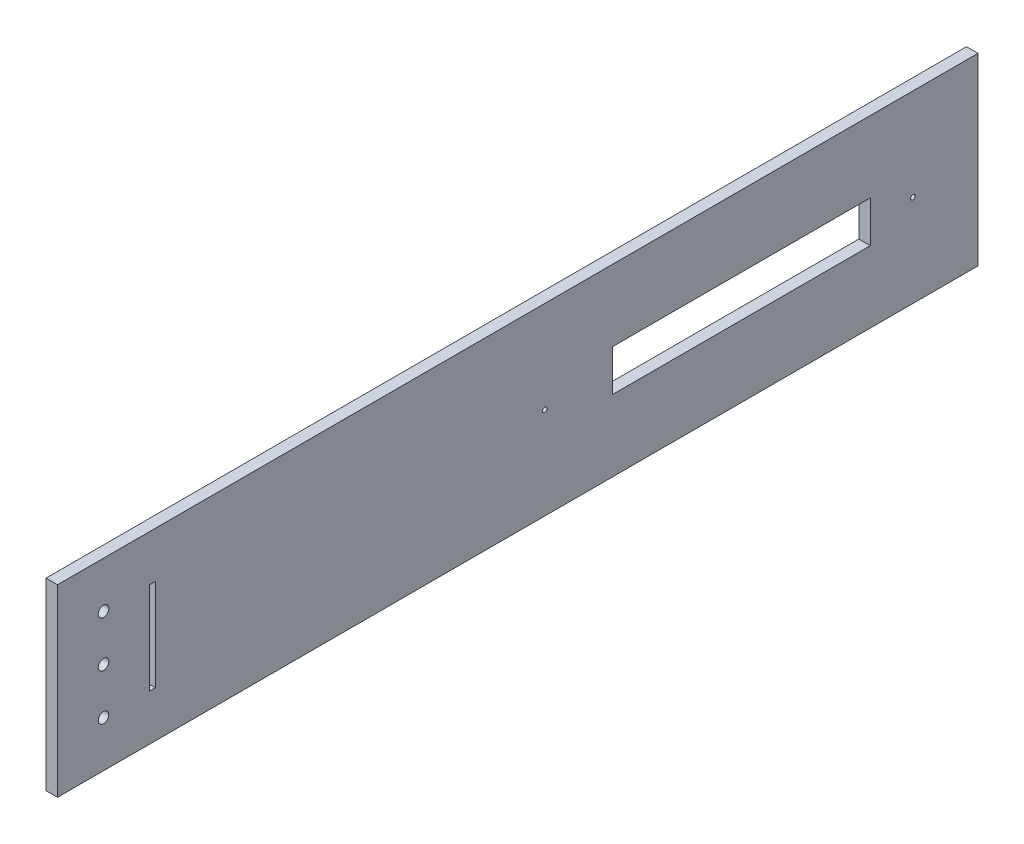
ISO-10303-21;
HEADER;
FILE_DESCRIPTION(('STEP AP214'),'2;1');
FILE_NAME('part.step','',(''),(''),'','','');
FILE_SCHEMA(('AUTOMOTIVE_DESIGN { 1 0 10303 214 1 1 1 1 }'));
ENDSEC;
DATA;
#1=APPLICATION_CONTEXT('core data for automotive mechanical design processes');
#2=APPLICATION_PROTOCOL_DEFINITION('international standard','automotive_design',2000,#1);
#3=PRODUCT_CONTEXT('',#1,'mechanical');
#4=PRODUCT('Part','Part','',(#3));
#5=PRODUCT_RELATED_PRODUCT_CATEGORY('part','',(#4));
#6=PRODUCT_DEFINITION_FORMATION('','',#4);
#7=PRODUCT_DEFINITION_CONTEXT('part definition',#1,'design');
#8=PRODUCT_DEFINITION('design','',#6,#7);
#9=PRODUCT_DEFINITION_SHAPE('','',#8);
#10=(LENGTH_UNIT() NAMED_UNIT(*) SI_UNIT(.MILLI.,.METRE.));
#11=(NAMED_UNIT(*) PLANE_ANGLE_UNIT() SI_UNIT($,.RADIAN.));
#12=(NAMED_UNIT(*) SI_UNIT($,.STERADIAN.) SOLID_ANGLE_UNIT());
#13=UNCERTAINTY_MEASURE_WITH_UNIT(LENGTH_MEASURE(1.E-05),#10,'distance_accuracy_value','');
#14=(GEOMETRIC_REPRESENTATION_CONTEXT(3) GLOBAL_UNCERTAINTY_ASSIGNED_CONTEXT((#13)) GLOBAL_UNIT_ASSIGNED_CONTEXT((#10,
#11,#12)) REPRESENTATION_CONTEXT('',''));
#15=CARTESIAN_POINT('',(0.,0.,0.));
#16=DIRECTION('',(0.,0.,1.));
#17=DIRECTION('',(1.,0.,0.));
#18=AXIS2_PLACEMENT_3D('',#15,#16,#17);
#19=CARTESIAN_POINT('',(-3.175,25.4,0.));
#20=DIRECTION('',(0.,0.,-1.));
#21=DIRECTION('',(0.,1.,0.));
#22=AXIS2_PLACEMENT_3D('',#19,#20,#21);
#23=PLANE('',#22);
#24=DIRECTION('',(0.,1.,0.));
#25=VECTOR('',#24,1.);
#26=CARTESIAN_POINT('',(0.,25.4,0.));
#27=LINE('',#26,#25);
#28=CARTESIAN_POINT('',(0.,-25.4,0.));
#29=VERTEX_POINT('',#28);
#30=CARTESIAN_POINT('',(0.,25.4,0.));
#31=VERTEX_POINT('',#30);
#32=EDGE_CURVE('E211',#29,#31,#27,.T.);
#33=ORIENTED_EDGE('',*,*,#32,.F.);
#34=DIRECTION('',(1.,0.,0.));
#35=VECTOR('',#34,1.);
#36=CARTESIAN_POINT('',(-3.175,-25.4,0.));
#37=LINE('',#36,#35);
#38=CARTESIAN_POINT('',(-3.175,-25.4,0.));
#39=VERTEX_POINT('',#38);
#40=EDGE_CURVE('E11',#39,#29,#37,.T.);
#41=ORIENTED_EDGE('',*,*,#40,.F.);
#42=DIRECTION('',(0.,1.,0.));
#43=VECTOR('',#42,1.);
#44=CARTESIAN_POINT('',(-3.175,25.4,0.));
#45=LINE('',#44,#43);
#46=CARTESIAN_POINT('',(-3.175,25.4,0.));
#47=VERTEX_POINT('',#46);
#48=EDGE_CURVE('E214',#39,#47,#45,.T.);
#49=ORIENTED_EDGE('',*,*,#48,.T.);
#50=DIRECTION('',(1.,0.,0.));
#51=VECTOR('',#50,1.);
#52=CARTESIAN_POINT('',(-3.175,25.4,0.));
#53=LINE('',#52,#51);
#54=EDGE_CURVE('E37',#47,#31,#53,.T.);
#55=ORIENTED_EDGE('',*,*,#54,.T.);
#56=EDGE_LOOP('',(#33,#41,#49,#55));
#57=FACE_BOUND('',#56,.T.);
#58=ADVANCED_FACE('F34',(#57),#23,.T.);
#59=CARTESIAN_POINT('',(-3.175,-25.4,0.));
#60=DIRECTION('',(0.,-1.,0.));
#61=DIRECTION('',(0.,0.,-1.));
#62=AXIS2_PLACEMENT_3D('',#59,#60,#61);
#63=PLANE('',#62);
#64=DIRECTION('',(0.,0.,-1.));
#65=VECTOR('',#64,1.);
#66=CARTESIAN_POINT('',(0.,-25.4,0.));
#67=LINE('',#66,#65);
#68=CARTESIAN_POINT('',(0.,-25.4,254.));
#69=VERTEX_POINT('',#68);
#70=EDGE_CURVE('E218',#69,#29,#67,.T.);
#71=ORIENTED_EDGE('',*,*,#70,.F.);
#72=DIRECTION('',(1.,0.,0.));
#73=VECTOR('',#72,1.);
#74=CARTESIAN_POINT('',(-3.175,-25.4,254.));
#75=LINE('',#74,#73);
#76=CARTESIAN_POINT('',(-3.175,-25.4,254.));
#77=VERTEX_POINT('',#76);
#78=EDGE_CURVE('E42',#77,#69,#75,.T.);
#79=ORIENTED_EDGE('',*,*,#78,.F.);
#80=DIRECTION('',(0.,0.,-1.));
#81=VECTOR('',#80,1.);
#82=CARTESIAN_POINT('',(-3.175,-25.4,0.));
#83=LINE('',#82,#81);
#84=EDGE_CURVE('E224',#77,#39,#83,.T.);
#85=ORIENTED_EDGE('',*,*,#84,.T.);
#86=ORIENTED_EDGE('',*,*,#40,.T.);
#87=EDGE_LOOP('',(#71,#79,#85,#86));
#88=FACE_BOUND('',#87,.T.);
#89=ADVANCED_FACE('F250',(#88),#63,.T.);
#90=CARTESIAN_POINT('',(-3.175,25.4,254.));
#91=DIRECTION('',(0.,0.,1.));
#92=DIRECTION('',(1.,0.,0.));
#93=AXIS2_PLACEMENT_3D('',#90,#91,#92);
#94=PLANE('',#93);
#95=DIRECTION('',(0.,-1.,0.));
#96=VECTOR('',#95,1.);
#97=CARTESIAN_POINT('',(0.,25.4,254.));
#98=LINE('',#97,#96);
#99=CARTESIAN_POINT('',(0.,25.4,254.));
#100=VERTEX_POINT('',#99);
#101=EDGE_CURVE('E232',#100,#69,#98,.T.);
#102=ORIENTED_EDGE('',*,*,#101,.F.);
#103=DIRECTION('',(1.,0.,0.));
#104=VECTOR('',#103,1.);
#105=CARTESIAN_POINT('',(-3.175,25.4,254.));
#106=LINE('',#105,#104);
#107=CARTESIAN_POINT('',(-3.175,25.4,254.));
#108=VERTEX_POINT('',#107);
#109=EDGE_CURVE('E237',#108,#100,#106,.T.);
#110=ORIENTED_EDGE('',*,*,#109,.F.);
#111=DIRECTION('',(0.,-1.,0.));
#112=VECTOR('',#111,1.);
#113=CARTESIAN_POINT('',(-3.175,25.4,254.));
#114=LINE('',#113,#112);
#115=EDGE_CURVE('E221',#108,#77,#114,.T.);
#116=ORIENTED_EDGE('',*,*,#115,.T.);
#117=ORIENTED_EDGE('',*,*,#78,.T.);
#118=EDGE_LOOP('',(#102,#110,#116,#117));
#119=FACE_BOUND('',#118,.T.);
#120=ADVANCED_FACE('F255',(#119),#94,.T.);
#121=CARTESIAN_POINT('',(-3.175,25.4,0.));
#122=DIRECTION('',(0.,1.,0.));
#123=DIRECTION('',(0.,0.,1.));
#124=AXIS2_PLACEMENT_3D('',#121,#122,#123);
#125=PLANE('',#124);
#126=DIRECTION('',(0.,0.,1.));
#127=VECTOR('',#126,1.);
#128=CARTESIAN_POINT('',(0.,25.4,0.));
#129=LINE('',#128,#127);
#130=EDGE_CURVE('E229',#31,#100,#129,.T.);
#131=ORIENTED_EDGE('',*,*,#130,.F.);
#132=ORIENTED_EDGE('',*,*,#54,.F.);
#133=DIRECTION('',(0.,0.,1.));
#134=VECTOR('',#133,1.);
#135=CARTESIAN_POINT('',(-3.175,25.4,0.));
#136=LINE('',#135,#134);
#137=EDGE_CURVE('E217',#47,#108,#136,.T.);
#138=ORIENTED_EDGE('',*,*,#137,.T.);
#139=ORIENTED_EDGE('',*,*,#109,.T.);
#140=EDGE_LOOP('',(#131,#132,#138,#139));
#141=FACE_BOUND('',#140,.T.);
#142=ADVANCED_FACE('F245',(#141),#125,.T.);
#143=CARTESIAN_POINT('',(-3.175,0.,0.));
#144=DIRECTION('',(-1.,0.,0.));
#145=DIRECTION('',(0.,0.,1.));
#146=AXIS2_PLACEMENT_3D('',#143,#144,#145);
#147=PLANE('',#146);
#148=CARTESIAN_POINT('',(-3.175,-12.7,241.3));
#149=DIRECTION('',(1.,0.,0.));
#150=DIRECTION('',(0.,0.,-1.));
#151=AXIS2_PLACEMENT_3D('',#148,#149,#150);
#152=CIRCLE('',#151,1.4605);
#153=CARTESIAN_POINT('',(-3.175,-12.7,239.8395));
#154=VERTEX_POINT('',#153);
#155=EDGE_CURVE('E430',#154,#154,#152,.T.);
#156=ORIENTED_EDGE('',*,*,#155,.T.);
#157=EDGE_LOOP('',(#156));
#158=FACE_BOUND('',#157,.T.);
#159=CARTESIAN_POINT('',(-3.175,12.7,241.3));
#160=DIRECTION('',(1.,0.,0.));
#161=DIRECTION('',(0.,0.,-1.));
#162=AXIS2_PLACEMENT_3D('',#159,#160,#161);
#163=CIRCLE('',#162,1.4605);
#164=CARTESIAN_POINT('',(-3.175,12.7,239.8395));
#165=VERTEX_POINT('',#164);
#166=EDGE_CURVE('E154',#165,#165,#163,.T.);
#167=ORIENTED_EDGE('',*,*,#166,.T.);
#168=EDGE_LOOP('',(#167));
#169=FACE_BOUND('',#168,.T.);
#170=DIRECTION('',(0.,1.,0.));
#171=VECTOR('',#170,1.);
#172=CARTESIAN_POINT('',(-3.175,12.7,227.0125));
#173=LINE('',#172,#171);
#174=CARTESIAN_POINT('',(-3.175,-12.7,227.0125));
#175=VERTEX_POINT('',#174);
#176=CARTESIAN_POINT('',(-3.175,12.7,227.0125));
#177=VERTEX_POINT('',#176);
#178=EDGE_CURVE('E125',#175,#177,#173,.T.);
#179=ORIENTED_EDGE('',*,*,#178,.T.);
#180=DIRECTION('',(0.,0.,1.));
#181=VECTOR('',#180,1.);
#182=CARTESIAN_POINT('',(-3.175,12.7,227.0125));
#183=LINE('',#182,#181);
#184=CARTESIAN_POINT('',(-3.175,12.7,228.6));
#185=VERTEX_POINT('',#184);
#186=EDGE_CURVE('E134',#177,#185,#183,.T.);
#187=ORIENTED_EDGE('',*,*,#186,.T.);
#188=DIRECTION('',(0.,-1.,0.));
#189=VECTOR('',#188,1.);
#190=CARTESIAN_POINT('',(-3.175,12.7,228.6));
#191=LINE('',#190,#189);
#192=CARTESIAN_POINT('',(-3.175,-12.7,228.6));
#193=VERTEX_POINT('',#192);
#194=EDGE_CURVE('E50',#185,#193,#191,.T.);
#195=ORIENTED_EDGE('',*,*,#194,.T.);
#196=DIRECTION('',(0.,0.,-1.));
#197=VECTOR('',#196,1.);
#198=CARTESIAN_POINT('',(-3.175,-12.7,227.0125));
#199=LINE('',#198,#197);
#200=EDGE_CURVE('E131',#193,#175,#199,.T.);
#201=ORIENTED_EDGE('',*,*,#200,.T.);
#202=EDGE_LOOP('',(#179,#187,#195,#201));
#203=FACE_BOUND('',#202,.T.);
#204=CARTESIAN_POINT('',(-3.175,0.,241.3));
#205=DIRECTION('',(1.,0.,0.));
#206=DIRECTION('',(0.,0.,-1.));
#207=AXIS2_PLACEMENT_3D('',#204,#205,#206);
#208=CIRCLE('',#207,1.4605);
#209=CARTESIAN_POINT('',(-3.175,0.,239.8395));
#210=VERTEX_POINT('',#209);
#211=EDGE_CURVE('E164',#210,#210,#208,.T.);
#212=ORIENTED_EDGE('',*,*,#211,.T.);
#213=EDGE_LOOP('',(#212));
#214=FACE_BOUND('',#213,.T.);
#215=DIRECTION('',(0.,1.,0.));
#216=VECTOR('',#215,1.);
#217=CARTESIAN_POINT('',(-3.175,5.71500000000001,29.7179999999999));
#218=LINE('',#217,#216);
#219=CARTESIAN_POINT('',(-3.175,-5.715,29.7179999999999));
#220=VERTEX_POINT('',#219);
#221=CARTESIAN_POINT('',(-3.175,5.71500000000001,29.7179999999999));
#222=VERTEX_POINT('',#221);
#223=EDGE_CURVE('E170',#220,#222,#218,.T.);
#224=ORIENTED_EDGE('',*,*,#223,.T.);
#225=DIRECTION('',(0.,0.,1.));
#226=VECTOR('',#225,1.);
#227=CARTESIAN_POINT('',(-3.175,5.71500000000001,29.7179999999999));
#228=LINE('',#227,#226);
#229=CARTESIAN_POINT('',(-3.175,5.71500000000001,100.872066825976));
#230=VERTEX_POINT('',#229);
#231=EDGE_CURVE('E173',#222,#230,#228,.T.);
#232=ORIENTED_EDGE('',*,*,#231,.T.);
#233=DIRECTION('',(0.,-1.,0.));
#234=VECTOR('',#233,1.);
#235=CARTESIAN_POINT('',(-3.175,5.71500000000001,100.872066825976));
#236=LINE('',#235,#234);
#237=CARTESIAN_POINT('',(-3.175,-5.71500000000001,100.872066825976));
#238=VERTEX_POINT('',#237);
#239=EDGE_CURVE('E177',#230,#238,#236,.T.);
#240=ORIENTED_EDGE('',*,*,#239,.T.);
#241=DIRECTION('',(0.,0.,-1.));
#242=VECTOR('',#241,1.);
#243=CARTESIAN_POINT('',(-3.175,-5.715,29.7179999999999));
#244=LINE('',#243,#242);
#245=EDGE_CURVE('E180',#238,#220,#244,.T.);
#246=ORIENTED_EDGE('',*,*,#245,.T.);
#247=EDGE_LOOP('',(#224,#232,#240,#246));
#248=FACE_BOUND('',#247,.T.);
#249=CARTESIAN_POINT('',(-3.175,0.,119.5578));
#250=DIRECTION('',(1.,0.,0.));
#251=DIRECTION('',(0.,0.,-1.));
#252=AXIS2_PLACEMENT_3D('',#249,#250,#251);
#253=CIRCLE('',#252,0.635000000000002);
#254=CARTESIAN_POINT('',(-3.175,0.,118.9228));
#255=VERTEX_POINT('',#254);
#256=EDGE_CURVE('E202',#255,#255,#253,.T.);
#257=ORIENTED_EDGE('',*,*,#256,.T.);
#258=EDGE_LOOP('',(#257));
#259=FACE_BOUND('',#258,.T.);
#260=CARTESIAN_POINT('',(-3.175,0.,17.9577999999999));
#261=DIRECTION('',(1.,0.,0.));
#262=DIRECTION('',(0.,0.,-1.));
#263=AXIS2_PLACEMENT_3D('',#260,#261,#262);
#264=CIRCLE('',#263,0.634999999999999);
#265=CARTESIAN_POINT('',(-3.175,0.,17.3227999999999));
#266=VERTEX_POINT('',#265);
#267=EDGE_CURVE('E208',#266,#266,#264,.T.);
#268=ORIENTED_EDGE('',*,*,#267,.T.);
#269=EDGE_LOOP('',(#268));
#270=FACE_BOUND('',#269,.T.);
#271=ORIENTED_EDGE('',*,*,#48,.F.);
#272=ORIENTED_EDGE('',*,*,#84,.F.);
#273=ORIENTED_EDGE('',*,*,#115,.F.);
#274=ORIENTED_EDGE('',*,*,#137,.F.);
#275=EDGE_LOOP('',(#271,#272,#273,#274));
#276=FACE_BOUND('',#275,.T.);
#277=ADVANCED_FACE('F138',(#158,#169,#203,#214,#248,#259,#270,#276),#147,.T.);
#278=CARTESIAN_POINT('',(0.,0.,0.));
#279=DIRECTION('',(-1.,0.,0.));
#280=DIRECTION('',(0.,0.,1.));
#281=AXIS2_PLACEMENT_3D('',#278,#279,#280);
#282=PLANE('',#281);
#283=CARTESIAN_POINT('',(0.,-12.7,241.3));
#284=DIRECTION('',(1.,0.,0.));
#285=DIRECTION('',(0.,0.,-1.));
#286=AXIS2_PLACEMENT_3D('',#283,#284,#285);
#287=CIRCLE('',#286,1.4605);
#288=CARTESIAN_POINT('',(0.,-12.7,239.8395));
#289=VERTEX_POINT('',#288);
#290=EDGE_CURVE('E433',#289,#289,#287,.T.);
#291=ORIENTED_EDGE('',*,*,#290,.F.);
#292=EDGE_LOOP('',(#291));
#293=FACE_BOUND('',#292,.T.);
#294=CARTESIAN_POINT('',(0.,12.7,241.3));
#295=DIRECTION('',(1.,0.,0.));
#296=DIRECTION('',(0.,0.,-1.));
#297=AXIS2_PLACEMENT_3D('',#294,#295,#296);
#298=CIRCLE('',#297,1.4605);
#299=CARTESIAN_POINT('',(0.,12.7,239.8395));
#300=VERTEX_POINT('',#299);
#301=EDGE_CURVE('E147',#300,#300,#298,.T.);
#302=ORIENTED_EDGE('',*,*,#301,.F.);
#303=EDGE_LOOP('',(#302));
#304=FACE_BOUND('',#303,.T.);
#305=DIRECTION('',(0.,0.,1.));
#306=VECTOR('',#305,1.);
#307=CARTESIAN_POINT('',(0.,12.7,227.0125));
#308=LINE('',#307,#306);
#309=CARTESIAN_POINT('',(0.,12.7,227.0125));
#310=VERTEX_POINT('',#309);
#311=CARTESIAN_POINT('',(0.,12.7,228.6));
#312=VERTEX_POINT('',#311);
#313=EDGE_CURVE('E153',#310,#312,#308,.T.);
#314=ORIENTED_EDGE('',*,*,#313,.F.);
#315=DIRECTION('',(0.,1.,0.));
#316=VECTOR('',#315,1.);
#317=CARTESIAN_POINT('',(0.,12.7,227.0125));
#318=LINE('',#317,#316);
#319=CARTESIAN_POINT('',(0.,-12.7,227.0125));
#320=VERTEX_POINT('',#319);
#321=EDGE_CURVE('E58',#320,#310,#318,.T.);
#322=ORIENTED_EDGE('',*,*,#321,.F.);
#323=DIRECTION('',(0.,0.,-1.));
#324=VECTOR('',#323,1.);
#325=CARTESIAN_POINT('',(0.,-12.7,227.0125));
#326=LINE('',#325,#324);
#327=CARTESIAN_POINT('',(0.,-12.7,228.6));
#328=VERTEX_POINT('',#327);
#329=EDGE_CURVE('E141',#328,#320,#326,.T.);
#330=ORIENTED_EDGE('',*,*,#329,.F.);
#331=DIRECTION('',(0.,-1.,0.));
#332=VECTOR('',#331,1.);
#333=CARTESIAN_POINT('',(0.,12.7,228.6));
#334=LINE('',#333,#332);
#335=EDGE_CURVE('E144',#312,#328,#334,.T.);
#336=ORIENTED_EDGE('',*,*,#335,.F.);
#337=EDGE_LOOP('',(#314,#322,#330,#336));
#338=FACE_BOUND('',#337,.T.);
#339=CARTESIAN_POINT('',(0.,0.,241.3));
#340=DIRECTION('',(1.,0.,0.));
#341=DIRECTION('',(0.,0.,-1.));
#342=AXIS2_PLACEMENT_3D('',#339,#340,#341);
#343=CIRCLE('',#342,1.4605);
#344=CARTESIAN_POINT('',(0.,0.,239.8395));
#345=VERTEX_POINT('',#344);
#346=EDGE_CURVE('E160',#345,#345,#343,.T.);
#347=ORIENTED_EDGE('',*,*,#346,.F.);
#348=EDGE_LOOP('',(#347));
#349=FACE_BOUND('',#348,.T.);
#350=DIRECTION('',(0.,0.,1.));
#351=VECTOR('',#350,1.);
#352=CARTESIAN_POINT('',(0.,5.71500000000001,29.7179999999999));
#353=LINE('',#352,#351);
#354=CARTESIAN_POINT('',(0.,5.71500000000001,29.7179999999999));
#355=VERTEX_POINT('',#354);
#356=CARTESIAN_POINT('',(0.,5.71500000000001,100.872066825976));
#357=VERTEX_POINT('',#356);
#358=EDGE_CURVE('E185',#355,#357,#353,.T.);
#359=ORIENTED_EDGE('',*,*,#358,.F.);
#360=DIRECTION('',(0.,1.,0.));
#361=VECTOR('',#360,1.);
#362=CARTESIAN_POINT('',(0.,5.71500000000001,29.7179999999999));
#363=LINE('',#362,#361);
#364=CARTESIAN_POINT('',(0.,-5.715,29.7179999999999));
#365=VERTEX_POINT('',#364);
#366=EDGE_CURVE('E167',#365,#355,#363,.T.);
#367=ORIENTED_EDGE('',*,*,#366,.F.);
#368=DIRECTION('',(0.,0.,-1.));
#369=VECTOR('',#368,1.);
#370=CARTESIAN_POINT('',(0.,-5.715,29.7179999999999));
#371=LINE('',#370,#369);
#372=CARTESIAN_POINT('',(0.,-5.71500000000001,100.872066825976));
#373=VERTEX_POINT('',#372);
#374=EDGE_CURVE('E174',#373,#365,#371,.T.);
#375=ORIENTED_EDGE('',*,*,#374,.F.);
#376=DIRECTION('',(0.,-1.,0.));
#377=VECTOR('',#376,1.);
#378=CARTESIAN_POINT('',(0.,5.71500000000001,100.872066825976));
#379=LINE('',#378,#377);
#380=EDGE_CURVE('E188',#357,#373,#379,.T.);
#381=ORIENTED_EDGE('',*,*,#380,.F.);
#382=EDGE_LOOP('',(#359,#367,#375,#381));
#383=FACE_BOUND('',#382,.T.);
#384=CARTESIAN_POINT('',(0.,0.,119.5578));
#385=DIRECTION('',(1.,0.,0.));
#386=DIRECTION('',(0.,0.,-1.));
#387=AXIS2_PLACEMENT_3D('',#384,#385,#386);
#388=CIRCLE('',#387,0.635000000000002);
#389=CARTESIAN_POINT('',(0.,0.,118.9228));
#390=VERTEX_POINT('',#389);
#391=EDGE_CURVE('E195',#390,#390,#388,.T.);
#392=ORIENTED_EDGE('',*,*,#391,.F.);
#393=EDGE_LOOP('',(#392));
#394=FACE_BOUND('',#393,.T.);
#395=CARTESIAN_POINT('',(0.,0.,17.9577999999999));
#396=DIRECTION('',(1.,0.,0.));
#397=DIRECTION('',(0.,0.,-1.));
#398=AXIS2_PLACEMENT_3D('',#395,#396,#397);
#399=CIRCLE('',#398,0.634999999999999);
#400=CARTESIAN_POINT('',(0.,0.,17.3227999999999));
#401=VERTEX_POINT('',#400);
#402=EDGE_CURVE('E205',#401,#401,#399,.T.);
#403=ORIENTED_EDGE('',*,*,#402,.F.);
#404=EDGE_LOOP('',(#403));
#405=FACE_BOUND('',#404,.T.);
#406=ORIENTED_EDGE('',*,*,#32,.T.);
#407=ORIENTED_EDGE('',*,*,#130,.T.);
#408=ORIENTED_EDGE('',*,*,#101,.T.);
#409=ORIENTED_EDGE('',*,*,#70,.T.);
#410=EDGE_LOOP('',(#406,#407,#408,#409));
#411=FACE_BOUND('',#410,.T.);
#412=ADVANCED_FACE('F247',(#293,#304,#338,#349,#383,#394,#405,#411),#282,.F.);
#413=CARTESIAN_POINT('',(-3.175,0.,17.9577999999999));
#414=DIRECTION('',(1.,0.,0.));
#415=DIRECTION('',(0.,0.,-1.));
#416=AXIS2_PLACEMENT_3D('',#413,#414,#415);
#417=CYLINDRICAL_SURFACE('',#416,0.634999999999999);
#418=ORIENTED_EDGE('',*,*,#267,.F.);
#419=EDGE_LOOP('',(#418));
#420=FACE_BOUND('',#419,.T.);
#421=ORIENTED_EDGE('',*,*,#402,.T.);
#422=EDGE_LOOP('',(#421));
#423=FACE_BOUND('',#422,.T.);
#424=ADVANCED_FACE('F298',(#420,#423),#417,.F.);
#425=CARTESIAN_POINT('',(-3.175,0.,119.5578));
#426=DIRECTION('',(1.,0.,0.));
#427=DIRECTION('',(0.,0.,-1.));
#428=AXIS2_PLACEMENT_3D('',#425,#426,#427);
#429=CYLINDRICAL_SURFACE('',#428,0.635000000000002);
#430=ORIENTED_EDGE('',*,*,#256,.F.);
#431=EDGE_LOOP('',(#430));
#432=FACE_BOUND('',#431,.T.);
#433=ORIENTED_EDGE('',*,*,#391,.T.);
#434=EDGE_LOOP('',(#433));
#435=FACE_BOUND('',#434,.T.);
#436=ADVANCED_FACE('F308',(#432,#435),#429,.F.);
#437=CARTESIAN_POINT('',(-3.175,5.71500000000001,29.7179999999999));
#438=DIRECTION('',(0.,0.,-1.));
#439=DIRECTION('',(0.,1.,0.));
#440=AXIS2_PLACEMENT_3D('',#437,#438,#439);
#441=PLANE('',#440);
#442=ORIENTED_EDGE('',*,*,#366,.T.);
#443=DIRECTION('',(1.,0.,0.));
#444=VECTOR('',#443,1.);
#445=CARTESIAN_POINT('',(-3.175,5.71500000000001,29.7179999999999));
#446=LINE('',#445,#444);
#447=EDGE_CURVE('E183',#222,#355,#446,.T.);
#448=ORIENTED_EDGE('',*,*,#447,.F.);
#449=ORIENTED_EDGE('',*,*,#223,.F.);
#450=DIRECTION('',(1.,0.,0.));
#451=VECTOR('',#450,1.);
#452=CARTESIAN_POINT('',(-3.175,-5.715,29.7179999999999));
#453=LINE('',#452,#451);
#454=EDGE_CURVE('E193',#220,#365,#453,.T.);
#455=ORIENTED_EDGE('',*,*,#454,.T.);
#456=EDGE_LOOP('',(#442,#448,#449,#455));
#457=FACE_BOUND('',#456,.T.);
#458=ADVANCED_FACE('F318',(#457),#441,.F.);
#459=CARTESIAN_POINT('',(-3.175,-5.715,29.7179999999999));
#460=DIRECTION('',(0.,-1.,0.));
#461=DIRECTION('',(0.,0.,-1.));
#462=AXIS2_PLACEMENT_3D('',#459,#460,#461);
#463=PLANE('',#462);
#464=ORIENTED_EDGE('',*,*,#374,.T.);
#465=ORIENTED_EDGE('',*,*,#454,.F.);
#466=ORIENTED_EDGE('',*,*,#245,.F.);
#467=DIRECTION('',(1.,0.,0.));
#468=VECTOR('',#467,1.);
#469=CARTESIAN_POINT('',(-3.175,-5.71500000000001,100.872066825976));
#470=LINE('',#469,#468);
#471=EDGE_CURVE('E196',#238,#373,#470,.T.);
#472=ORIENTED_EDGE('',*,*,#471,.T.);
#473=EDGE_LOOP('',(#464,#465,#466,#472));
#474=FACE_BOUND('',#473,.T.);
#475=ADVANCED_FACE('F328',(#474),#463,.F.);
#476=CARTESIAN_POINT('',(-3.175,5.71500000000001,100.872066825976));
#477=DIRECTION('',(0.,0.,1.));
#478=DIRECTION('',(1.,0.,0.));
#479=AXIS2_PLACEMENT_3D('',#476,#477,#478);
#480=PLANE('',#479);
#481=ORIENTED_EDGE('',*,*,#380,.T.);
#482=ORIENTED_EDGE('',*,*,#471,.F.);
#483=ORIENTED_EDGE('',*,*,#239,.F.);
#484=DIRECTION('',(1.,0.,0.));
#485=VECTOR('',#484,1.);
#486=CARTESIAN_POINT('',(-3.175,5.71500000000001,100.872066825976));
#487=LINE('',#486,#485);
#488=EDGE_CURVE('E198',#230,#357,#487,.T.);
#489=ORIENTED_EDGE('',*,*,#488,.T.);
#490=EDGE_LOOP('',(#481,#482,#483,#489));
#491=FACE_BOUND('',#490,.T.);
#492=ADVANCED_FACE('F338',(#491),#480,.F.);
#493=CARTESIAN_POINT('',(-3.175,5.71500000000001,29.7179999999999));
#494=DIRECTION('',(0.,1.,0.));
#495=DIRECTION('',(0.,0.,1.));
#496=AXIS2_PLACEMENT_3D('',#493,#494,#495);
#497=PLANE('',#496);
#498=ORIENTED_EDGE('',*,*,#358,.T.);
#499=ORIENTED_EDGE('',*,*,#488,.F.);
#500=ORIENTED_EDGE('',*,*,#231,.F.);
#501=ORIENTED_EDGE('',*,*,#447,.T.);
#502=EDGE_LOOP('',(#498,#499,#500,#501));
#503=FACE_BOUND('',#502,.T.);
#504=ADVANCED_FACE('F348',(#503),#497,.F.);
#505=CARTESIAN_POINT('',(-3.175,0.,241.3));
#506=DIRECTION('',(1.,0.,0.));
#507=DIRECTION('',(0.,0.,-1.));
#508=AXIS2_PLACEMENT_3D('',#505,#506,#507);
#509=CYLINDRICAL_SURFACE('',#508,1.4605);
#510=ORIENTED_EDGE('',*,*,#211,.F.);
#511=EDGE_LOOP('',(#510));
#512=FACE_BOUND('',#511,.T.);
#513=ORIENTED_EDGE('',*,*,#346,.T.);
#514=EDGE_LOOP('',(#513));
#515=FACE_BOUND('',#514,.T.);
#516=ADVANCED_FACE('F358',(#512,#515),#509,.F.);
#517=CARTESIAN_POINT('',(-3.175,12.7,227.0125));
#518=DIRECTION('',(0.,0.,-1.));
#519=DIRECTION('',(-1.,0.,0.));
#520=AXIS2_PLACEMENT_3D('',#517,#518,#519);
#521=PLANE('',#520);
#522=ORIENTED_EDGE('',*,*,#321,.T.);
#523=DIRECTION('',(1.,0.,0.));
#524=VECTOR('',#523,1.);
#525=CARTESIAN_POINT('',(-3.175,12.7,227.0125));
#526=LINE('',#525,#524);
#527=EDGE_CURVE('E121',#177,#310,#526,.T.);
#528=ORIENTED_EDGE('',*,*,#527,.F.);
#529=ORIENTED_EDGE('',*,*,#178,.F.);
#530=DIRECTION('',(1.,0.,0.));
#531=VECTOR('',#530,1.);
#532=CARTESIAN_POINT('',(-3.175,-12.7,227.0125));
#533=LINE('',#532,#531);
#534=EDGE_CURVE('E158',#175,#320,#533,.T.);
#535=ORIENTED_EDGE('',*,*,#534,.T.);
#536=EDGE_LOOP('',(#522,#528,#529,#535));
#537=FACE_BOUND('',#536,.T.);
#538=ADVANCED_FACE('F123',(#537),#521,.F.);
#539=CARTESIAN_POINT('',(-3.175,-12.7,227.0125));
#540=DIRECTION('',(0.,-1.,0.));
#541=DIRECTION('',(0.,0.,-1.));
#542=AXIS2_PLACEMENT_3D('',#539,#540,#541);
#543=PLANE('',#542);
#544=ORIENTED_EDGE('',*,*,#329,.T.);
#545=ORIENTED_EDGE('',*,*,#534,.F.);
#546=ORIENTED_EDGE('',*,*,#200,.F.);
#547=DIRECTION('',(1.,0.,0.));
#548=VECTOR('',#547,1.);
#549=CARTESIAN_POINT('',(-3.175,-12.7,228.6));
#550=LINE('',#549,#548);
#551=EDGE_CURVE('E161',#193,#328,#550,.T.);
#552=ORIENTED_EDGE('',*,*,#551,.T.);
#553=EDGE_LOOP('',(#544,#545,#546,#552));
#554=FACE_BOUND('',#553,.T.);
#555=ADVANCED_FACE('F377',(#554),#543,.F.);
#556=CARTESIAN_POINT('',(-3.175,12.7,228.6));
#557=DIRECTION('',(0.,0.,1.));
#558=DIRECTION('',(1.,0.,0.));
#559=AXIS2_PLACEMENT_3D('',#556,#557,#558);
#560=PLANE('',#559);
#561=ORIENTED_EDGE('',*,*,#335,.T.);
#562=ORIENTED_EDGE('',*,*,#551,.F.);
#563=ORIENTED_EDGE('',*,*,#194,.F.);
#564=DIRECTION('',(1.,0.,0.));
#565=VECTOR('',#564,1.);
#566=CARTESIAN_POINT('',(-3.175,12.7,228.6));
#567=LINE('',#566,#565);
#568=EDGE_CURVE('E130',#185,#312,#567,.T.);
#569=ORIENTED_EDGE('',*,*,#568,.T.);
#570=EDGE_LOOP('',(#561,#562,#563,#569));
#571=FACE_BOUND('',#570,.T.);
#572=ADVANCED_FACE('F386',(#571),#560,.F.);
#573=CARTESIAN_POINT('',(-3.175,12.7,227.0125));
#574=DIRECTION('',(0.,1.,0.));
#575=DIRECTION('',(0.,0.,1.));
#576=AXIS2_PLACEMENT_3D('',#573,#574,#575);
#577=PLANE('',#576);
#578=ORIENTED_EDGE('',*,*,#313,.T.);
#579=ORIENTED_EDGE('',*,*,#568,.F.);
#580=ORIENTED_EDGE('',*,*,#186,.F.);
#581=ORIENTED_EDGE('',*,*,#527,.T.);
#582=EDGE_LOOP('',(#578,#579,#580,#581));
#583=FACE_BOUND('',#582,.T.);
#584=ADVANCED_FACE('F135',(#583),#577,.F.);
#585=CARTESIAN_POINT('',(-3.175,12.7,241.3));
#586=DIRECTION('',(1.,0.,0.));
#587=DIRECTION('',(0.,0.,-1.));
#588=AXIS2_PLACEMENT_3D('',#585,#586,#587);
#589=CYLINDRICAL_SURFACE('',#588,1.4605);
#590=ORIENTED_EDGE('',*,*,#166,.F.);
#591=EDGE_LOOP('',(#590));
#592=FACE_BOUND('',#591,.T.);
#593=ORIENTED_EDGE('',*,*,#301,.T.);
#594=EDGE_LOOP('',(#593));
#595=FACE_BOUND('',#594,.T.);
#596=ADVANCED_FACE('F404',(#592,#595),#589,.F.);
#597=CARTESIAN_POINT('',(-3.175,-12.7,241.3));
#598=DIRECTION('',(1.,0.,0.));
#599=DIRECTION('',(0.,0.,-1.));
#600=AXIS2_PLACEMENT_3D('',#597,#598,#599);
#601=CYLINDRICAL_SURFACE('',#600,1.4605);
#602=ORIENTED_EDGE('',*,*,#155,.F.);
#603=EDGE_LOOP('',(#602));
#604=FACE_BOUND('',#603,.T.);
#605=ORIENTED_EDGE('',*,*,#290,.T.);
#606=EDGE_LOOP('',(#605));
#607=FACE_BOUND('',#606,.T.);
#608=ADVANCED_FACE('F413',(#604,#607),#601,.F.);
#609=CLOSED_SHELL('',(#58,#89,#120,#142,#277,#412,#424,#436,#458,#475,#492,#504,#516,#538,#555,
#572,#584,#596,#608));
#610=MANIFOLD_SOLID_BREP('B2',#609);
#611=ADVANCED_BREP_SHAPE_REPRESENTATION('',(#18,#610),#14);
#612=SHAPE_DEFINITION_REPRESENTATION(#9,#611);
ENDSEC;
END-ISO-10303-21;
